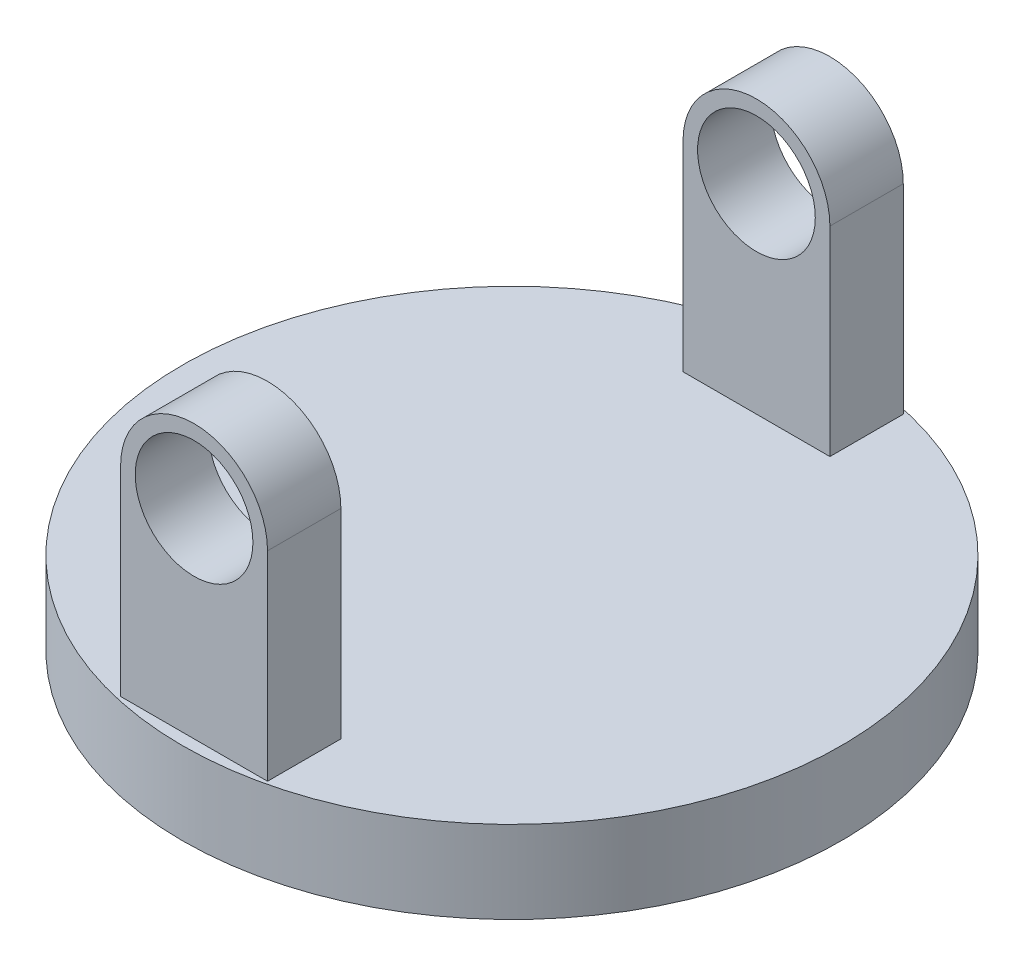
ISO-10303-21;
HEADER;
FILE_DESCRIPTION(('STEP AP214'),'2;1');
FILE_NAME('part.step','',(''),(''),'','','');
FILE_SCHEMA(('AUTOMOTIVE_DESIGN { 1 0 10303 214 1 1 1 1 }'));
ENDSEC;
DATA;
#1=APPLICATION_CONTEXT('core data for automotive mechanical design processes');
#2=APPLICATION_PROTOCOL_DEFINITION('international standard','automotive_design',2000,#1);
#3=PRODUCT_CONTEXT('',#1,'mechanical');
#4=PRODUCT('Part','Part','',(#3));
#5=PRODUCT_RELATED_PRODUCT_CATEGORY('part','',(#4));
#6=PRODUCT_DEFINITION_FORMATION('','',#4);
#7=PRODUCT_DEFINITION_CONTEXT('part definition',#1,'design');
#8=PRODUCT_DEFINITION('design','',#6,#7);
#9=PRODUCT_DEFINITION_SHAPE('','',#8);
#10=(LENGTH_UNIT() NAMED_UNIT(*) SI_UNIT(.MILLI.,.METRE.));
#11=(NAMED_UNIT(*) PLANE_ANGLE_UNIT() SI_UNIT($,.RADIAN.));
#12=(NAMED_UNIT(*) SI_UNIT($,.STERADIAN.) SOLID_ANGLE_UNIT());
#13=UNCERTAINTY_MEASURE_WITH_UNIT(LENGTH_MEASURE(1.E-05),#10,'distance_accuracy_value','');
#14=(GEOMETRIC_REPRESENTATION_CONTEXT(3) GLOBAL_UNCERTAINTY_ASSIGNED_CONTEXT((#13)) GLOBAL_UNIT_ASSIGNED_CONTEXT((#10,
#11,#12)) REPRESENTATION_CONTEXT('',''));
#15=CARTESIAN_POINT('',(0.,0.,0.));
#16=DIRECTION('',(0.,0.,1.));
#17=DIRECTION('',(1.,0.,0.));
#18=AXIS2_PLACEMENT_3D('',#15,#16,#17);
#19=CARTESIAN_POINT('',(0.,7.,0.));
#20=DIRECTION('',(0.,-1.,0.));
#21=DIRECTION('',(0.,0.,-1.));
#22=AXIS2_PLACEMENT_3D('',#19,#20,#21);
#23=CYLINDRICAL_SURFACE('',#22,28.);
#24=CARTESIAN_POINT('',(0.,7.,0.));
#25=DIRECTION('',(0.,1.,0.));
#26=DIRECTION('',(0.,0.,1.));
#27=AXIS2_PLACEMENT_3D('',#24,#25,#26);
#28=CIRCLE('',#27,28.);
#29=CARTESIAN_POINT('',(0.,7.,28.));
#30=VERTEX_POINT('',#29);
#31=EDGE_CURVE('E160',#30,#30,#28,.T.);
#32=ORIENTED_EDGE('',*,*,#31,.F.);
#33=EDGE_LOOP('',(#32));
#34=FACE_BOUND('',#33,.T.);
#35=CARTESIAN_POINT('',(0.,0.,0.));
#36=DIRECTION('',(0.,1.,0.));
#37=DIRECTION('',(0.,0.,1.));
#38=AXIS2_PLACEMENT_3D('',#35,#36,#37);
#39=CIRCLE('',#38,28.);
#40=CARTESIAN_POINT('',(0.,0.,28.));
#41=VERTEX_POINT('',#40);
#42=EDGE_CURVE('E159',#41,#41,#39,.T.);
#43=ORIENTED_EDGE('',*,*,#42,.T.);
#44=EDGE_LOOP('',(#43));
#45=FACE_BOUND('',#44,.T.);
#46=ADVANCED_FACE('F39',(#34,#45),#23,.T.);
#47=CARTESIAN_POINT('',(0.,7.,0.));
#48=DIRECTION('',(0.,1.,0.));
#49=DIRECTION('',(0.,0.,1.));
#50=AXIS2_PLACEMENT_3D('',#47,#48,#49);
#51=PLANE('',#50);
#52=DIRECTION('',(-1.,0.,0.));
#53=VECTOR('',#52,1.);
#54=CARTESIAN_POINT('',(0.,7.,-27.0059240446929));
#55=LINE('',#54,#53);
#56=CARTESIAN_POINT('',(6.24147689537665,7.,-27.0059240446929));
#57=VERTEX_POINT('',#56);
#58=CARTESIAN_POINT('',(-6.24147689537665,7.,-27.0059240446929));
#59=VERTEX_POINT('',#58);
#60=EDGE_CURVE('E11',#57,#59,#55,.T.);
#61=ORIENTED_EDGE('',*,*,#60,.F.);
#62=DIRECTION('',(0.,0.,1.));
#63=VECTOR('',#62,1.);
#64=CARTESIAN_POINT('',(6.24147689537665,7.,-27.0059240446929));
#65=LINE('',#64,#63);
#66=CARTESIAN_POINT('',(6.24147689537665,7.,-20.7735243067557));
#67=VERTEX_POINT('',#66);
#68=EDGE_CURVE('E115',#57,#67,#65,.T.);
#69=ORIENTED_EDGE('',*,*,#68,.T.);
#70=DIRECTION('',(-1.,0.,0.));
#71=VECTOR('',#70,1.);
#72=CARTESIAN_POINT('',(0.,7.,-20.7735243067557));
#73=LINE('',#72,#71);
#74=CARTESIAN_POINT('',(-6.24147689537665,7.,-20.7735243067557));
#75=VERTEX_POINT('',#74);
#76=EDGE_CURVE('E46',#67,#75,#73,.T.);
#77=ORIENTED_EDGE('',*,*,#76,.T.);
#78=DIRECTION('',(0.,0.,1.));
#79=VECTOR('',#78,1.);
#80=CARTESIAN_POINT('',(-6.24147689537665,7.,-27.0059240446929));
#81=LINE('',#80,#79);
#82=EDGE_CURVE('E124',#59,#75,#81,.T.);
#83=ORIENTED_EDGE('',*,*,#82,.F.);
#84=EDGE_LOOP('',(#61,#69,#77,#83));
#85=FACE_BOUND('',#84,.T.);
#86=DIRECTION('',(1.,0.,0.));
#87=VECTOR('',#86,1.);
#88=CARTESIAN_POINT('',(0.,7.,27.0059240446929));
#89=LINE('',#88,#87);
#90=CARTESIAN_POINT('',(-6.24147689537665,7.,27.0059240446929));
#91=VERTEX_POINT('',#90);
#92=CARTESIAN_POINT('',(6.24147689537665,7.,27.0059240446929));
#93=VERTEX_POINT('',#92);
#94=EDGE_CURVE('E110',#91,#93,#89,.T.);
#95=ORIENTED_EDGE('',*,*,#94,.F.);
#96=DIRECTION('',(0.,0.,-1.));
#97=VECTOR('',#96,1.);
#98=CARTESIAN_POINT('',(-6.24147689537665,7.,27.0059240446929));
#99=LINE('',#98,#97);
#100=CARTESIAN_POINT('',(-6.24147689537665,7.,20.7735243067557));
#101=VERTEX_POINT('',#100);
#102=EDGE_CURVE('E152',#91,#101,#99,.T.);
#103=ORIENTED_EDGE('',*,*,#102,.T.);
#104=DIRECTION('',(1.,0.,0.));
#105=VECTOR('',#104,1.);
#106=CARTESIAN_POINT('',(0.,7.,20.7735243067557));
#107=LINE('',#106,#105);
#108=CARTESIAN_POINT('',(6.24147689537665,7.,20.7735243067557));
#109=VERTEX_POINT('',#108);
#110=EDGE_CURVE('E163',#101,#109,#107,.T.);
#111=ORIENTED_EDGE('',*,*,#110,.T.);
#112=DIRECTION('',(0.,0.,-1.));
#113=VECTOR('',#112,1.);
#114=CARTESIAN_POINT('',(6.24147689537665,7.,27.0059240446929));
#115=LINE('',#114,#113);
#116=EDGE_CURVE('E150',#93,#109,#115,.T.);
#117=ORIENTED_EDGE('',*,*,#116,.F.);
#118=EDGE_LOOP('',(#95,#103,#111,#117));
#119=FACE_BOUND('',#118,.T.);
#120=ORIENTED_EDGE('',*,*,#31,.T.);
#121=EDGE_LOOP('',(#120));
#122=FACE_BOUND('',#121,.T.);
#123=ADVANCED_FACE('F121',(#85,#119,#122),#51,.T.);
#124=CARTESIAN_POINT('',(0.,0.,0.));
#125=DIRECTION('',(0.,1.,0.));
#126=DIRECTION('',(0.,0.,1.));
#127=AXIS2_PLACEMENT_3D('',#124,#125,#126);
#128=PLANE('',#127);
#129=ORIENTED_EDGE('',*,*,#42,.F.);
#130=EDGE_LOOP('',(#129));
#131=FACE_BOUND('',#130,.T.);
#132=ADVANCED_FACE('F194',(#131),#128,.F.);
#133=CARTESIAN_POINT('',(6.24147689537665,0.,27.0059240446929));
#134=DIRECTION('',(1.,0.,0.));
#135=DIRECTION('',(0.,0.,-1.));
#136=AXIS2_PLACEMENT_3D('',#133,#134,#135);
#137=PLANE('',#136);
#138=ORIENTED_EDGE('',*,*,#116,.T.);
#139=DIRECTION('',(0.,-1.,0.));
#140=VECTOR('',#139,1.);
#141=CARTESIAN_POINT('',(6.24147689537665,0.,20.7735243067557));
#142=LINE('',#141,#140);
#143=CARTESIAN_POINT('',(6.24147689537665,23.9564808616644,20.7735243067557));
#144=VERTEX_POINT('',#143);
#145=EDGE_CURVE('E61',#144,#109,#142,.T.);
#146=ORIENTED_EDGE('',*,*,#145,.F.);
#147=DIRECTION('',(0.,0.,-1.));
#148=VECTOR('',#147,1.);
#149=CARTESIAN_POINT('',(6.24147689537665,23.9564808616644,27.0059240446929));
#150=LINE('',#149,#148);
#151=CARTESIAN_POINT('',(6.24147689537665,23.9564808616644,27.0059240446929));
#152=VERTEX_POINT('',#151);
#153=EDGE_CURVE('E157',#152,#144,#150,.T.);
#154=ORIENTED_EDGE('',*,*,#153,.F.);
#155=DIRECTION('',(0.,-1.,0.));
#156=VECTOR('',#155,1.);
#157=CARTESIAN_POINT('',(6.24147689537665,0.,27.0059240446929));
#158=LINE('',#157,#156);
#159=EDGE_CURVE('E142',#152,#93,#158,.T.);
#160=ORIENTED_EDGE('',*,*,#159,.T.);
#161=EDGE_LOOP('',(#138,#146,#154,#160));
#162=FACE_BOUND('',#161,.T.);
#163=ADVANCED_FACE('F175',(#162),#137,.T.);
#164=CARTESIAN_POINT('',(0.,23.9564808616644,27.0059240446929));
#165=DIRECTION('',(0.,0.,-1.));
#166=DIRECTION('',(-1.,0.,0.));
#167=AXIS2_PLACEMENT_3D('',#164,#165,#166);
#168=CYLINDRICAL_SURFACE('',#167,6.24147689537665);
#169=ORIENTED_EDGE('',*,*,#153,.T.);
#170=CARTESIAN_POINT('',(0.,23.9564808616644,20.7735243067557));
#171=DIRECTION('',(0.,0.,1.));
#172=DIRECTION('',(1.,0.,0.));
#173=AXIS2_PLACEMENT_3D('',#170,#171,#172);
#174=CIRCLE('',#173,6.24147689537665);
#175=CARTESIAN_POINT('',(-6.24147689537665,23.9564808616644,20.7735243067557));
#176=VERTEX_POINT('',#175);
#177=EDGE_CURVE('E133',#144,#176,#174,.T.);
#178=ORIENTED_EDGE('',*,*,#177,.T.);
#179=DIRECTION('',(0.,0.,-1.));
#180=VECTOR('',#179,1.);
#181=CARTESIAN_POINT('',(-6.24147689537665,23.9564808616644,27.0059240446929));
#182=LINE('',#181,#180);
#183=CARTESIAN_POINT('',(-6.24147689537665,23.9564808616644,27.0059240446929));
#184=VERTEX_POINT('',#183);
#185=EDGE_CURVE('E155',#184,#176,#182,.T.);
#186=ORIENTED_EDGE('',*,*,#185,.F.);
#187=CARTESIAN_POINT('',(0.,23.9564808616644,27.0059240446929));
#188=DIRECTION('',(0.,0.,1.));
#189=DIRECTION('',(1.,0.,0.));
#190=AXIS2_PLACEMENT_3D('',#187,#188,#189);
#191=CIRCLE('',#190,6.24147689537665);
#192=EDGE_CURVE('E145',#152,#184,#191,.T.);
#193=ORIENTED_EDGE('',*,*,#192,.F.);
#194=EDGE_LOOP('',(#169,#178,#186,#193));
#195=FACE_BOUND('',#194,.T.);
#196=ADVANCED_FACE('F185',(#195),#168,.T.);
#197=CARTESIAN_POINT('',(-6.24147689537665,0.,27.0059240446929));
#198=DIRECTION('',(-1.,0.,0.));
#199=DIRECTION('',(0.,0.,1.));
#200=AXIS2_PLACEMENT_3D('',#197,#198,#199);
#201=PLANE('',#200);
#202=ORIENTED_EDGE('',*,*,#185,.T.);
#203=DIRECTION('',(0.,1.,0.));
#204=VECTOR('',#203,1.);
#205=CARTESIAN_POINT('',(-6.24147689537665,0.,20.7735243067557));
#206=LINE('',#205,#204);
#207=EDGE_CURVE('E136',#101,#176,#206,.T.);
#208=ORIENTED_EDGE('',*,*,#207,.F.);
#209=ORIENTED_EDGE('',*,*,#102,.F.);
#210=DIRECTION('',(0.,1.,0.));
#211=VECTOR('',#210,1.);
#212=CARTESIAN_POINT('',(-6.24147689537665,0.,27.0059240446929));
#213=LINE('',#212,#211);
#214=EDGE_CURVE('E147',#91,#184,#213,.T.);
#215=ORIENTED_EDGE('',*,*,#214,.T.);
#216=EDGE_LOOP('',(#202,#208,#209,#215));
#217=FACE_BOUND('',#216,.T.);
#218=ADVANCED_FACE('F182',(#217),#201,.T.);
#219=CARTESIAN_POINT('',(0.,23.9564808616644,27.0059240446929));
#220=DIRECTION('',(0.,0.,-1.));
#221=DIRECTION('',(-1.,0.,0.));
#222=AXIS2_PLACEMENT_3D('',#219,#220,#221);
#223=CYLINDRICAL_SURFACE('',#222,5.);
#224=CARTESIAN_POINT('',(0.,23.9564808616644,27.0059240446929));
#225=DIRECTION('',(0.,0.,1.));
#226=DIRECTION('',(1.,0.,0.));
#227=AXIS2_PLACEMENT_3D('',#224,#225,#226);
#228=CIRCLE('',#227,5.);
#229=CARTESIAN_POINT('',(5.,23.9564808616644,27.0059240446929));
#230=VERTEX_POINT('',#229);
#231=EDGE_CURVE('E139',#230,#230,#228,.T.);
#232=ORIENTED_EDGE('',*,*,#231,.T.);
#233=EDGE_LOOP('',(#232));
#234=FACE_BOUND('',#233,.T.);
#235=CARTESIAN_POINT('',(0.,23.9564808616644,20.7735243067557));
#236=DIRECTION('',(0.,0.,1.));
#237=DIRECTION('',(1.,0.,0.));
#238=AXIS2_PLACEMENT_3D('',#235,#236,#237);
#239=CIRCLE('',#238,5.);
#240=CARTESIAN_POINT('',(5.,23.9564808616644,20.7735243067557));
#241=VERTEX_POINT('',#240);
#242=EDGE_CURVE('E123',#241,#241,#239,.T.);
#243=ORIENTED_EDGE('',*,*,#242,.F.);
#244=EDGE_LOOP('',(#243));
#245=FACE_BOUND('',#244,.T.);
#246=ADVANCED_FACE('F192',(#234,#245),#223,.F.);
#247=CARTESIAN_POINT('',(0.,0.,27.0059240446929));
#248=DIRECTION('',(0.,0.,1.));
#249=DIRECTION('',(1.,0.,0.));
#250=AXIS2_PLACEMENT_3D('',#247,#248,#249);
#251=PLANE('',#250);
#252=ORIENTED_EDGE('',*,*,#231,.F.);
#253=EDGE_LOOP('',(#252));
#254=FACE_BOUND('',#253,.T.);
#255=ORIENTED_EDGE('',*,*,#214,.F.);
#256=ORIENTED_EDGE('',*,*,#94,.T.);
#257=ORIENTED_EDGE('',*,*,#159,.F.);
#258=ORIENTED_EDGE('',*,*,#192,.T.);
#259=EDGE_LOOP('',(#255,#256,#257,#258));
#260=FACE_BOUND('',#259,.T.);
#261=ADVANCED_FACE('F172',(#254,#260),#251,.T.);
#262=CARTESIAN_POINT('',(0.,0.,20.7735243067557));
#263=DIRECTION('',(0.,0.,1.));
#264=DIRECTION('',(1.,0.,0.));
#265=AXIS2_PLACEMENT_3D('',#262,#263,#264);
#266=PLANE('',#265);
#267=ORIENTED_EDGE('',*,*,#110,.F.);
#268=ORIENTED_EDGE('',*,*,#207,.T.);
#269=ORIENTED_EDGE('',*,*,#177,.F.);
#270=ORIENTED_EDGE('',*,*,#145,.T.);
#271=EDGE_LOOP('',(#267,#268,#269,#270));
#272=FACE_BOUND('',#271,.T.);
#273=ORIENTED_EDGE('',*,*,#242,.T.);
#274=EDGE_LOOP('',(#273));
#275=FACE_BOUND('',#274,.T.);
#276=ADVANCED_FACE('F179',(#272,#275),#266,.F.);
#277=CARTESIAN_POINT('',(6.24147689537665,0.,-27.0059240446929));
#278=DIRECTION('',(-1.,0.,0.));
#279=DIRECTION('',(0.,0.,1.));
#280=AXIS2_PLACEMENT_3D('',#277,#278,#279);
#281=PLANE('',#280);
#282=DIRECTION('',(0.,0.,1.));
#283=VECTOR('',#282,1.);
#284=CARTESIAN_POINT('',(6.24147689537665,23.9564808616644,-27.0059240446929));
#285=LINE('',#284,#283);
#286=CARTESIAN_POINT('',(6.24147689537665,23.9564808616644,-27.0059240446929));
#287=VERTEX_POINT('',#286);
#288=CARTESIAN_POINT('',(6.24147689537665,23.9564808616644,-20.7735243067557));
#289=VERTEX_POINT('',#288);
#290=EDGE_CURVE('E117',#287,#289,#285,.T.);
#291=ORIENTED_EDGE('',*,*,#290,.T.);
#292=DIRECTION('',(0.,-1.,0.));
#293=VECTOR('',#292,1.);
#294=CARTESIAN_POINT('',(6.24147689537665,0.,-20.7735243067557));
#295=LINE('',#294,#293);
#296=EDGE_CURVE('E106',#289,#67,#295,.T.);
#297=ORIENTED_EDGE('',*,*,#296,.T.);
#298=ORIENTED_EDGE('',*,*,#68,.F.);
#299=DIRECTION('',(0.,-1.,0.));
#300=VECTOR('',#299,1.);
#301=CARTESIAN_POINT('',(6.24147689537665,0.,-27.0059240446929));
#302=LINE('',#301,#300);
#303=EDGE_CURVE('E341',#287,#57,#302,.T.);
#304=ORIENTED_EDGE('',*,*,#303,.F.);
#305=EDGE_LOOP('',(#291,#297,#298,#304));
#306=FACE_BOUND('',#305,.T.);
#307=ADVANCED_FACE('F113',(#306),#281,.F.);
#308=CARTESIAN_POINT('',(-6.24147689537665,0.,-27.0059240446929));
#309=DIRECTION('',(1.,0.,0.));
#310=DIRECTION('',(0.,0.,-1.));
#311=AXIS2_PLACEMENT_3D('',#308,#309,#310);
#312=PLANE('',#311);
#313=ORIENTED_EDGE('',*,*,#82,.T.);
#314=DIRECTION('',(0.,1.,0.));
#315=VECTOR('',#314,1.);
#316=CARTESIAN_POINT('',(-6.24147689537665,0.,-20.7735243067557));
#317=LINE('',#316,#315);
#318=CARTESIAN_POINT('',(-6.24147689537665,23.9564808616644,-20.7735243067557));
#319=VERTEX_POINT('',#318);
#320=EDGE_CURVE('E53',#75,#319,#317,.T.);
#321=ORIENTED_EDGE('',*,*,#320,.T.);
#322=DIRECTION('',(0.,0.,1.));
#323=VECTOR('',#322,1.);
#324=CARTESIAN_POINT('',(-6.24147689537665,23.9564808616644,-27.0059240446929));
#325=LINE('',#324,#323);
#326=CARTESIAN_POINT('',(-6.24147689537665,23.9564808616644,-27.0059240446929));
#327=VERTEX_POINT('',#326);
#328=EDGE_CURVE('E128',#327,#319,#325,.T.);
#329=ORIENTED_EDGE('',*,*,#328,.F.);
#330=DIRECTION('',(0.,1.,0.));
#331=VECTOR('',#330,1.);
#332=CARTESIAN_POINT('',(-6.24147689537665,0.,-27.0059240446929));
#333=LINE('',#332,#331);
#334=EDGE_CURVE('E345',#59,#327,#333,.T.);
#335=ORIENTED_EDGE('',*,*,#334,.F.);
#336=EDGE_LOOP('',(#313,#321,#329,#335));
#337=FACE_BOUND('',#336,.T.);
#338=ADVANCED_FACE('F225',(#337),#312,.F.);
#339=CARTESIAN_POINT('',(0.,23.9564808616644,-27.0059240446929));
#340=DIRECTION('',(0.,0.,1.));
#341=DIRECTION('',(1.,0.,0.));
#342=AXIS2_PLACEMENT_3D('',#339,#340,#341);
#343=CYLINDRICAL_SURFACE('',#342,5.);
#344=CARTESIAN_POINT('',(0.,23.9564808616644,-27.0059240446929));
#345=DIRECTION('',(0.,0.,1.));
#346=DIRECTION('',(1.,0.,0.));
#347=AXIS2_PLACEMENT_3D('',#344,#345,#346);
#348=CIRCLE('',#347,5.);
#349=CARTESIAN_POINT('',(5.,23.9564808616644,-27.0059240446929));
#350=VERTEX_POINT('',#349);
#351=EDGE_CURVE('E339',#350,#350,#348,.T.);
#352=ORIENTED_EDGE('',*,*,#351,.F.);
#353=EDGE_LOOP('',(#352));
#354=FACE_BOUND('',#353,.T.);
#355=CARTESIAN_POINT('',(0.,23.9564808616644,-20.7735243067557));
#356=DIRECTION('',(0.,0.,1.));
#357=DIRECTION('',(1.,0.,0.));
#358=AXIS2_PLACEMENT_3D('',#355,#356,#357);
#359=CIRCLE('',#358,5.);
#360=CARTESIAN_POINT('',(5.,23.9564808616644,-20.7735243067557));
#361=VERTEX_POINT('',#360);
#362=EDGE_CURVE('E119',#361,#361,#359,.T.);
#363=ORIENTED_EDGE('',*,*,#362,.T.);
#364=EDGE_LOOP('',(#363));
#365=FACE_BOUND('',#364,.T.);
#366=ADVANCED_FACE('F228',(#354,#365),#343,.F.);
#367=CARTESIAN_POINT('',(0.,23.9564808616644,-27.0059240446929));
#368=DIRECTION('',(0.,0.,1.));
#369=DIRECTION('',(1.,0.,0.));
#370=AXIS2_PLACEMENT_3D('',#367,#368,#369);
#371=CYLINDRICAL_SURFACE('',#370,6.24147689537665);
#372=ORIENTED_EDGE('',*,*,#328,.T.);
#373=CARTESIAN_POINT('',(0.,23.9564808616644,-20.7735243067557));
#374=DIRECTION('',(0.,0.,1.));
#375=DIRECTION('',(1.,0.,0.));
#376=AXIS2_PLACEMENT_3D('',#373,#374,#375);
#377=CIRCLE('',#376,6.24147689537665);
#378=EDGE_CURVE('E348',#289,#319,#377,.T.);
#379=ORIENTED_EDGE('',*,*,#378,.F.);
#380=ORIENTED_EDGE('',*,*,#290,.F.);
#381=CARTESIAN_POINT('',(0.,23.9564808616644,-27.0059240446929));
#382=DIRECTION('',(0.,0.,1.));
#383=DIRECTION('',(1.,0.,0.));
#384=AXIS2_PLACEMENT_3D('',#381,#382,#383);
#385=CIRCLE('',#384,6.24147689537665);
#386=EDGE_CURVE('E344',#287,#327,#385,.T.);
#387=ORIENTED_EDGE('',*,*,#386,.T.);
#388=EDGE_LOOP('',(#372,#379,#380,#387));
#389=FACE_BOUND('',#388,.T.);
#390=ADVANCED_FACE('F230',(#389),#371,.T.);
#391=CARTESIAN_POINT('',(0.,0.,-27.0059240446929));
#392=DIRECTION('',(0.,0.,-1.));
#393=DIRECTION('',(1.,0.,0.));
#394=AXIS2_PLACEMENT_3D('',#391,#392,#393);
#395=PLANE('',#394);
#396=ORIENTED_EDGE('',*,*,#351,.T.);
#397=EDGE_LOOP('',(#396));
#398=FACE_BOUND('',#397,.T.);
#399=ORIENTED_EDGE('',*,*,#303,.T.);
#400=ORIENTED_EDGE('',*,*,#60,.T.);
#401=ORIENTED_EDGE('',*,*,#334,.T.);
#402=ORIENTED_EDGE('',*,*,#386,.F.);
#403=EDGE_LOOP('',(#399,#400,#401,#402));
#404=FACE_BOUND('',#403,.T.);
#405=ADVANCED_FACE('F238',(#398,#404),#395,.T.);
#406=CARTESIAN_POINT('',(0.,0.,-20.7735243067557));
#407=DIRECTION('',(0.,0.,-1.));
#408=DIRECTION('',(1.,0.,0.));
#409=AXIS2_PLACEMENT_3D('',#406,#407,#408);
#410=PLANE('',#409);
#411=ORIENTED_EDGE('',*,*,#76,.F.);
#412=ORIENTED_EDGE('',*,*,#296,.F.);
#413=ORIENTED_EDGE('',*,*,#378,.T.);
#414=ORIENTED_EDGE('',*,*,#320,.F.);
#415=EDGE_LOOP('',(#411,#412,#413,#414));
#416=FACE_BOUND('',#415,.T.);
#417=ORIENTED_EDGE('',*,*,#362,.F.);
#418=EDGE_LOOP('',(#417));
#419=FACE_BOUND('',#418,.T.);
#420=ADVANCED_FACE('F104',(#416,#419),#410,.F.);
#421=CLOSED_SHELL('',(#46,#123,#132,#163,#196,#218,#246,#261,#276,#307,#338,#366,#390,#405,#420));
#422=MANIFOLD_SOLID_BREP('B2',#421);
#423=ADVANCED_BREP_SHAPE_REPRESENTATION('',(#18,#422),#14);
#424=SHAPE_DEFINITION_REPRESENTATION(#9,#423);
ENDSEC;
END-ISO-10303-21;
